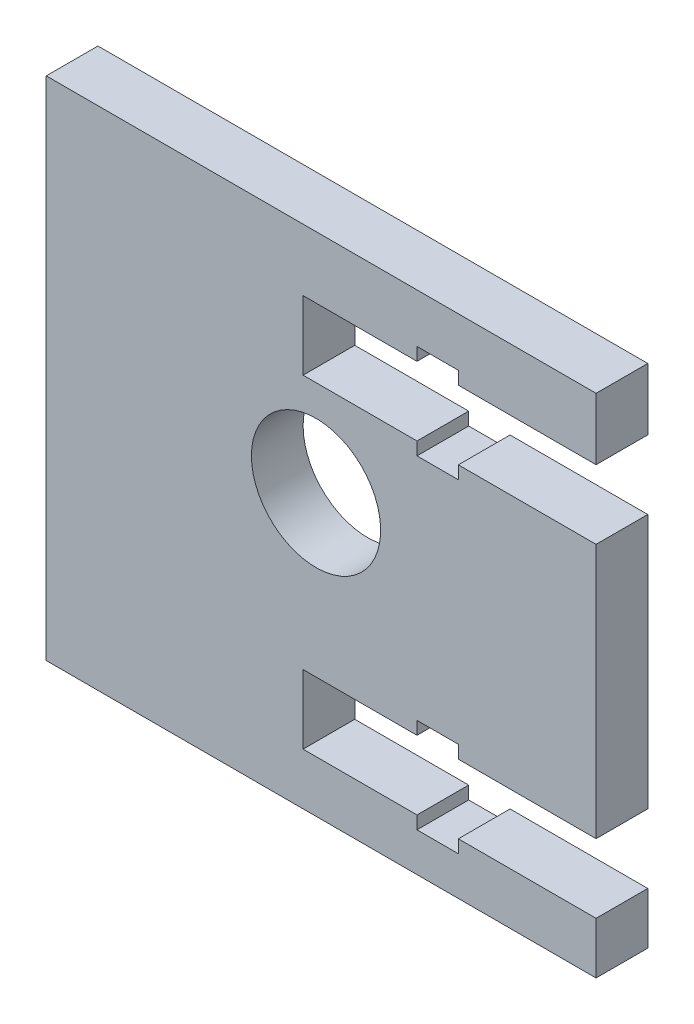
ISO-10303-21;
HEADER;
FILE_DESCRIPTION(('STEP AP214'),'2;1');
FILE_NAME('part.step','',(''),(''),'','','');
FILE_SCHEMA(('AUTOMOTIVE_DESIGN { 1 0 10303 214 1 1 1 1 }'));
ENDSEC;
DATA;
#1=APPLICATION_CONTEXT('core data for automotive mechanical design processes');
#2=APPLICATION_PROTOCOL_DEFINITION('international standard','automotive_design',2000,#1);
#3=PRODUCT_CONTEXT('',#1,'mechanical');
#4=PRODUCT('Part','Part','',(#3));
#5=PRODUCT_RELATED_PRODUCT_CATEGORY('part','',(#4));
#6=PRODUCT_DEFINITION_FORMATION('','',#4);
#7=PRODUCT_DEFINITION_CONTEXT('part definition',#1,'design');
#8=PRODUCT_DEFINITION('design','',#6,#7);
#9=PRODUCT_DEFINITION_SHAPE('','',#8);
#10=(LENGTH_UNIT() NAMED_UNIT(*) SI_UNIT(.MILLI.,.METRE.));
#11=(NAMED_UNIT(*) PLANE_ANGLE_UNIT() SI_UNIT($,.RADIAN.));
#12=(NAMED_UNIT(*) SI_UNIT($,.STERADIAN.) SOLID_ANGLE_UNIT());
#13=UNCERTAINTY_MEASURE_WITH_UNIT(LENGTH_MEASURE(1.E-05),#10,'distance_accuracy_value','');
#14=(GEOMETRIC_REPRESENTATION_CONTEXT(3) GLOBAL_UNCERTAINTY_ASSIGNED_CONTEXT((#13)) GLOBAL_UNIT_ASSIGNED_CONTEXT((#10,
#11,#12)) REPRESENTATION_CONTEXT('',''));
#15=CARTESIAN_POINT('',(0.,0.,0.));
#16=DIRECTION('',(0.,0.,1.));
#17=DIRECTION('',(1.,0.,0.));
#18=AXIS2_PLACEMENT_3D('',#15,#16,#17);
#19=CARTESIAN_POINT('',(29.5456401917048,83.560043446571,3.));
#20=DIRECTION('',(1.,0.,0.));
#21=DIRECTION('',(0.,1.,0.));
#22=AXIS2_PLACEMENT_3D('',#19,#20,#21);
#23=PLANE('',#22);
#24=DIRECTION('',(0.,-1.,0.));
#25=VECTOR('',#24,1.);
#26=CARTESIAN_POINT('',(29.5456401917048,83.560043446571,3.));
#27=LINE('',#26,#25);
#28=CARTESIAN_POINT('',(29.5456401917048,84.150043446571,3.));
#29=VERTEX_POINT('',#28);
#30=CARTESIAN_POINT('',(29.5456401917048,80.560043446571,3.));
#31=VERTEX_POINT('',#30);
#32=EDGE_CURVE('E363',#29,#31,#27,.T.);
#33=ORIENTED_EDGE('',*,*,#32,.T.);
#34=DIRECTION('',(0.,0.,1.));
#35=VECTOR('',#34,1.);
#36=CARTESIAN_POINT('',(29.5456401917048,80.560043446571,-30.));
#37=LINE('',#36,#35);
#38=CARTESIAN_POINT('',(29.5456401917048,80.560043446571,0.));
#39=VERTEX_POINT('',#38);
#40=EDGE_CURVE('E222',#39,#31,#37,.T.);
#41=ORIENTED_EDGE('',*,*,#40,.F.);
#42=DIRECTION('',(0.,-1.,0.));
#43=VECTOR('',#42,1.);
#44=CARTESIAN_POINT('',(29.5456401917048,83.560043446571,0.));
#45=LINE('',#44,#43);
#46=CARTESIAN_POINT('',(29.5456401917048,84.150043446571,0.));
#47=VERTEX_POINT('',#46);
#48=EDGE_CURVE('E217',#47,#39,#45,.T.);
#49=ORIENTED_EDGE('',*,*,#48,.F.);
#50=DIRECTION('',(0.,0.,1.));
#51=VECTOR('',#50,1.);
#52=CARTESIAN_POINT('',(29.5456401917048,84.150043446571,0.));
#53=LINE('',#52,#51);
#54=EDGE_CURVE('E220',#47,#29,#53,.T.);
#55=ORIENTED_EDGE('',*,*,#54,.T.);
#56=EDGE_LOOP('',(#33,#41,#49,#55));
#57=FACE_BOUND('',#56,.T.);
#58=ADVANCED_FACE('F32',(#57),#23,.T.);
#59=CARTESIAN_POINT('',(29.5456401917048,76.560043446571,0.));
#60=VERTEX_POINT('',#59);
#61=CARTESIAN_POINT('',(29.5456401917048,61.7690391399457,0.));
#62=VERTEX_POINT('',#61);
#63=EDGE_CURVE('E226',#60,#62,#45,.T.);
#64=ORIENTED_EDGE('',*,*,#63,.F.);
#65=DIRECTION('',(0.,0.,1.));
#66=VECTOR('',#65,1.);
#67=CARTESIAN_POINT('',(29.5456401917048,76.560043446571,-30.));
#68=LINE('',#67,#66);
#69=CARTESIAN_POINT('',(29.5456401917048,76.560043446571,3.));
#70=VERTEX_POINT('',#69);
#71=EDGE_CURVE('E300',#60,#70,#68,.T.);
#72=ORIENTED_EDGE('',*,*,#71,.T.);
#73=CARTESIAN_POINT('',(29.5456401917048,61.7690391399457,3.));
#74=VERTEX_POINT('',#73);
#75=EDGE_CURVE('E366',#70,#74,#27,.T.);
#76=ORIENTED_EDGE('',*,*,#75,.T.);
#77=DIRECTION('',(0.,0.,1.));
#78=VECTOR('',#77,1.);
#79=CARTESIAN_POINT('',(29.5456401917048,61.7690391399457,-30.));
#80=LINE('',#79,#78);
#81=EDGE_CURVE('E309',#62,#74,#80,.T.);
#82=ORIENTED_EDGE('',*,*,#81,.F.);
#83=EDGE_LOOP('',(#64,#72,#76,#82));
#84=FACE_BOUND('',#83,.T.);
#85=ADVANCED_FACE('F439',(#84),#23,.T.);
#86=DIRECTION('',(0.,0.,1.));
#87=VECTOR('',#86,1.);
#88=CARTESIAN_POINT('',(29.5456401917048,57.7690391399457,-30.));
#89=LINE('',#88,#87);
#90=CARTESIAN_POINT('',(29.5456401917048,57.7690391399457,0.));
#91=VERTEX_POINT('',#90);
#92=CARTESIAN_POINT('',(29.5456401917048,57.7690391399457,3.));
#93=VERTEX_POINT('',#92);
#94=EDGE_CURVE('E305',#91,#93,#89,.T.);
#95=ORIENTED_EDGE('',*,*,#94,.T.);
#96=CARTESIAN_POINT('',(29.5456401917048,54.7690391399457,3.));
#97=VERTEX_POINT('',#96);
#98=EDGE_CURVE('E367',#93,#97,#27,.T.);
#99=ORIENTED_EDGE('',*,*,#98,.T.);
#100=DIRECTION('',(0.,0.,-1.));
#101=VECTOR('',#100,1.);
#102=CARTESIAN_POINT('',(29.5456401917048,54.7690391399457,3.));
#103=LINE('',#102,#101);
#104=CARTESIAN_POINT('',(29.5456401917048,54.7690391399457,0.));
#105=VERTEX_POINT('',#104);
#106=EDGE_CURVE('E371',#97,#105,#103,.T.);
#107=ORIENTED_EDGE('',*,*,#106,.T.);
#108=EDGE_CURVE('E228',#91,#105,#45,.T.);
#109=ORIENTED_EDGE('',*,*,#108,.F.);
#110=EDGE_LOOP('',(#95,#99,#107,#109));
#111=FACE_BOUND('',#110,.T.);
#112=ADVANCED_FACE('F447',(#111),#23,.T.);
#113=CARTESIAN_POINT('',(0.,0.,3.));
#114=DIRECTION('',(0.,0.,-1.));
#115=DIRECTION('',(-1.,0.,0.));
#116=AXIS2_PLACEMENT_3D('',#113,#114,#115);
#117=PLANE('',#116);
#118=CARTESIAN_POINT('',(13.2979166249883,71.0167627066596,3.));
#119=DIRECTION('',(0.,0.,-1.));
#120=DIRECTION('',(-1.,0.,0.));
#121=AXIS2_PLACEMENT_3D('',#118,#119,#120);
#122=CIRCLE('',#121,3.75000000000002);
#123=CARTESIAN_POINT('',(9.54791662498832,71.0167627066596,3.));
#124=VERTEX_POINT('',#123);
#125=EDGE_CURVE('E360',#124,#124,#122,.T.);
#126=ORIENTED_EDGE('',*,*,#125,.T.);
#127=EDGE_LOOP('',(#126));
#128=FACE_BOUND('',#127,.T.);
#129=DIRECTION('',(1.,0.,0.));
#130=VECTOR('',#129,1.);
#131=CARTESIAN_POINT('',(21.5557408577982,80.560043446571,3.));
#132=LINE('',#131,#130);
#133=CARTESIAN_POINT('',(21.5557408577982,80.560043446571,3.));
#134=VERTEX_POINT('',#133);
#135=EDGE_CURVE('E247',#134,#31,#132,.T.);
#136=ORIENTED_EDGE('',*,*,#135,.T.);
#137=ORIENTED_EDGE('',*,*,#32,.F.);
#138=DIRECTION('',(-1.,0.,0.));
#139=VECTOR('',#138,1.);
#140=CARTESIAN_POINT('',(29.5456401917048,84.150043446571,3.));
#141=LINE('',#140,#139);
#142=CARTESIAN_POINT('',(-2.35612776278136,84.150043446571,3.));
#143=VERTEX_POINT('',#142);
#144=EDGE_CURVE('E235',#29,#143,#141,.T.);
#145=ORIENTED_EDGE('',*,*,#144,.T.);
#146=DIRECTION('',(0.,-1.,0.));
#147=VECTOR('',#146,1.);
#148=CARTESIAN_POINT('',(-2.35612776278136,83.560043446571,3.));
#149=LINE('',#148,#147);
#150=CARTESIAN_POINT('',(-2.35612776278136,54.7690391399457,3.));
#151=VERTEX_POINT('',#150);
#152=EDGE_CURVE('E370',#143,#151,#149,.T.);
#153=ORIENTED_EDGE('',*,*,#152,.T.);
#154=DIRECTION('',(1.,0.,0.));
#155=VECTOR('',#154,1.);
#156=CARTESIAN_POINT('',(-2.35612776278136,54.7690391399457,3.));
#157=LINE('',#156,#155);
#158=EDGE_CURVE('E365',#151,#97,#157,.T.);
#159=ORIENTED_EDGE('',*,*,#158,.T.);
#160=ORIENTED_EDGE('',*,*,#98,.F.);
#161=DIRECTION('',(1.,0.,0.));
#162=VECTOR('',#161,1.);
#163=CARTESIAN_POINT('',(21.5557408577982,57.7690391399457,3.));
#164=LINE('',#163,#162);
#165=CARTESIAN_POINT('',(21.5557408577982,57.7690391399457,3.));
#166=VERTEX_POINT('',#165);
#167=EDGE_CURVE('E251',#166,#93,#164,.T.);
#168=ORIENTED_EDGE('',*,*,#167,.F.);
#169=DIRECTION('',(0.,1.,0.));
#170=VECTOR('',#169,1.);
#171=CARTESIAN_POINT('',(21.5557408577982,57.0190391399457,3.));
#172=LINE('',#171,#170);
#173=CARTESIAN_POINT('',(21.5557408577982,57.0190391399457,3.));
#174=VERTEX_POINT('',#173);
#175=EDGE_CURVE('E308',#174,#166,#172,.T.);
#176=ORIENTED_EDGE('',*,*,#175,.F.);
#177=DIRECTION('',(1.,0.,0.));
#178=VECTOR('',#177,1.);
#179=CARTESIAN_POINT('',(19.1557408577982,57.0190391399457,3.));
#180=LINE('',#179,#178);
#181=CARTESIAN_POINT('',(19.1557408577982,57.0190391399457,3.));
#182=VERTEX_POINT('',#181);
#183=EDGE_CURVE('E331',#182,#174,#180,.T.);
#184=ORIENTED_EDGE('',*,*,#183,.F.);
#185=DIRECTION('',(0.,-1.,0.));
#186=VECTOR('',#185,1.);
#187=CARTESIAN_POINT('',(19.1557408577982,57.7690391399457,3.));
#188=LINE('',#187,#186);
#189=CARTESIAN_POINT('',(19.1557408577982,57.7690391399457,3.));
#190=VERTEX_POINT('',#189);
#191=EDGE_CURVE('E334',#190,#182,#188,.T.);
#192=ORIENTED_EDGE('',*,*,#191,.F.);
#193=DIRECTION('',(1.,0.,0.));
#194=VECTOR('',#193,1.);
#195=CARTESIAN_POINT('',(12.5456401917048,57.7690391399457,3.));
#196=LINE('',#195,#194);
#197=CARTESIAN_POINT('',(12.5456401917048,57.7690391399457,3.));
#198=VERTEX_POINT('',#197);
#199=EDGE_CURVE('E337',#198,#190,#196,.T.);
#200=ORIENTED_EDGE('',*,*,#199,.F.);
#201=DIRECTION('',(0.,-1.,0.));
#202=VECTOR('',#201,1.);
#203=CARTESIAN_POINT('',(12.5456401917048,61.7690391399457,3.));
#204=LINE('',#203,#202);
#205=CARTESIAN_POINT('',(12.5456401917048,61.7690391399457,3.));
#206=VERTEX_POINT('',#205);
#207=EDGE_CURVE('E340',#206,#198,#204,.T.);
#208=ORIENTED_EDGE('',*,*,#207,.F.);
#209=DIRECTION('',(-1.,0.,0.));
#210=VECTOR('',#209,1.);
#211=CARTESIAN_POINT('',(19.1557408577982,61.7690391399457,3.));
#212=LINE('',#211,#210);
#213=CARTESIAN_POINT('',(19.1557408577982,61.7690391399457,3.));
#214=VERTEX_POINT('',#213);
#215=EDGE_CURVE('E343',#214,#206,#212,.T.);
#216=ORIENTED_EDGE('',*,*,#215,.F.);
#217=DIRECTION('',(0.,1.,0.));
#218=VECTOR('',#217,1.);
#219=CARTESIAN_POINT('',(19.1557408577982,61.7690391399457,3.));
#220=LINE('',#219,#218);
#221=CARTESIAN_POINT('',(19.1557408577982,62.5190391399457,3.));
#222=VERTEX_POINT('',#221);
#223=EDGE_CURVE('E346',#214,#222,#220,.T.);
#224=ORIENTED_EDGE('',*,*,#223,.T.);
#225=DIRECTION('',(1.,0.,0.));
#226=VECTOR('',#225,1.);
#227=CARTESIAN_POINT('',(19.1557408577982,62.5190391399457,3.));
#228=LINE('',#227,#226);
#229=CARTESIAN_POINT('',(21.5557408577982,62.5190391399457,3.));
#230=VERTEX_POINT('',#229);
#231=EDGE_CURVE('E349',#222,#230,#228,.T.);
#232=ORIENTED_EDGE('',*,*,#231,.T.);
#233=DIRECTION('',(0.,-1.,0.));
#234=VECTOR('',#233,1.);
#235=CARTESIAN_POINT('',(21.5557408577982,62.5190391399457,3.));
#236=LINE('',#235,#234);
#237=CARTESIAN_POINT('',(21.5557408577982,61.7690391399457,3.));
#238=VERTEX_POINT('',#237);
#239=EDGE_CURVE('E352',#230,#238,#236,.T.);
#240=ORIENTED_EDGE('',*,*,#239,.T.);
#241=DIRECTION('',(-1.,0.,0.));
#242=VECTOR('',#241,1.);
#243=CARTESIAN_POINT('',(29.5456401917048,61.7690391399457,3.));
#244=LINE('',#243,#242);
#245=EDGE_CURVE('E355',#74,#238,#244,.T.);
#246=ORIENTED_EDGE('',*,*,#245,.F.);
#247=ORIENTED_EDGE('',*,*,#75,.F.);
#248=DIRECTION('',(-1.,0.,0.));
#249=VECTOR('',#248,1.);
#250=CARTESIAN_POINT('',(29.5456401917048,76.560043446571,3.));
#251=LINE('',#250,#249);
#252=CARTESIAN_POINT('',(21.5557408577982,76.560043446571,3.));
#253=VERTEX_POINT('',#252);
#254=EDGE_CURVE('E250',#70,#253,#251,.T.);
#255=ORIENTED_EDGE('',*,*,#254,.T.);
#256=DIRECTION('',(0.,1.,0.));
#257=VECTOR('',#256,1.);
#258=CARTESIAN_POINT('',(21.5557408577982,75.810043446571,3.));
#259=LINE('',#258,#257);
#260=CARTESIAN_POINT('',(21.5557408577982,75.810043446571,3.));
#261=VERTEX_POINT('',#260);
#262=EDGE_CURVE('E254',#261,#253,#259,.T.);
#263=ORIENTED_EDGE('',*,*,#262,.F.);
#264=DIRECTION('',(1.,0.,0.));
#265=VECTOR('',#264,1.);
#266=CARTESIAN_POINT('',(19.1557408577982,75.810043446571,3.));
#267=LINE('',#266,#265);
#268=CARTESIAN_POINT('',(19.1557408577982,75.810043446571,3.));
#269=VERTEX_POINT('',#268);
#270=EDGE_CURVE('E257',#269,#261,#267,.T.);
#271=ORIENTED_EDGE('',*,*,#270,.F.);
#272=DIRECTION('',(0.,-1.,0.));
#273=VECTOR('',#272,1.);
#274=CARTESIAN_POINT('',(19.1557408577982,76.560043446571,3.));
#275=LINE('',#274,#273);
#276=CARTESIAN_POINT('',(19.1557408577982,76.560043446571,3.));
#277=VERTEX_POINT('',#276);
#278=EDGE_CURVE('E260',#277,#269,#275,.T.);
#279=ORIENTED_EDGE('',*,*,#278,.F.);
#280=DIRECTION('',(-1.,0.,0.));
#281=VECTOR('',#280,1.);
#282=CARTESIAN_POINT('',(19.1557408577982,76.560043446571,3.));
#283=LINE('',#282,#281);
#284=CARTESIAN_POINT('',(12.5456401917048,76.560043446571,3.));
#285=VERTEX_POINT('',#284);
#286=EDGE_CURVE('E263',#277,#285,#283,.T.);
#287=ORIENTED_EDGE('',*,*,#286,.T.);
#288=DIRECTION('',(0.,1.,0.));
#289=VECTOR('',#288,1.);
#290=CARTESIAN_POINT('',(12.5456401917048,76.560043446571,3.));
#291=LINE('',#290,#289);
#292=CARTESIAN_POINT('',(12.5456401917048,80.560043446571,3.));
#293=VERTEX_POINT('',#292);
#294=EDGE_CURVE('E266',#285,#293,#291,.T.);
#295=ORIENTED_EDGE('',*,*,#294,.T.);
#296=DIRECTION('',(1.,0.,0.));
#297=VECTOR('',#296,1.);
#298=CARTESIAN_POINT('',(12.5456401917048,80.560043446571,3.));
#299=LINE('',#298,#297);
#300=CARTESIAN_POINT('',(19.1557408577982,80.560043446571,3.));
#301=VERTEX_POINT('',#300);
#302=EDGE_CURVE('E269',#293,#301,#299,.T.);
#303=ORIENTED_EDGE('',*,*,#302,.T.);
#304=DIRECTION('',(0.,1.,0.));
#305=VECTOR('',#304,1.);
#306=CARTESIAN_POINT('',(19.1557408577982,80.560043446571,3.));
#307=LINE('',#306,#305);
#308=CARTESIAN_POINT('',(19.1557408577982,81.310043446571,3.));
#309=VERTEX_POINT('',#308);
#310=EDGE_CURVE('E272',#301,#309,#307,.T.);
#311=ORIENTED_EDGE('',*,*,#310,.T.);
#312=DIRECTION('',(1.,0.,0.));
#313=VECTOR('',#312,1.);
#314=CARTESIAN_POINT('',(19.1557408577982,81.310043446571,3.));
#315=LINE('',#314,#313);
#316=CARTESIAN_POINT('',(21.5557408577982,81.310043446571,3.));
#317=VERTEX_POINT('',#316);
#318=EDGE_CURVE('E275',#309,#317,#315,.T.);
#319=ORIENTED_EDGE('',*,*,#318,.T.);
#320=DIRECTION('',(0.,-1.,0.));
#321=VECTOR('',#320,1.);
#322=CARTESIAN_POINT('',(21.5557408577982,81.310043446571,3.));
#323=LINE('',#322,#321);
#324=EDGE_CURVE('E278',#317,#134,#323,.T.);
#325=ORIENTED_EDGE('',*,*,#324,.T.);
#326=EDGE_LOOP('',(#136,#137,#145,#153,#159,#160,#168,#176,#184,#192,#200,#208,#216,#224,#232,
#240,#246,#247,#255,#263,#271,#279,#287,#295,#303,#311,#319,#325));
#327=FACE_BOUND('',#326,.T.);
#328=ADVANCED_FACE('F456',(#128,#327),#117,.F.);
#329=CARTESIAN_POINT('',(0.,0.,0.));
#330=DIRECTION('',(0.,0.,-1.));
#331=DIRECTION('',(-1.,0.,0.));
#332=AXIS2_PLACEMENT_3D('',#329,#330,#331);
#333=PLANE('',#332);
#334=CARTESIAN_POINT('',(13.2979166249883,71.0167627066596,0.));
#335=DIRECTION('',(0.,0.,-1.));
#336=DIRECTION('',(-1.,0.,0.));
#337=AXIS2_PLACEMENT_3D('',#334,#335,#336);
#338=CIRCLE('',#337,3.75000000000002);
#339=CARTESIAN_POINT('',(9.54791662498832,71.0167627066596,0.));
#340=VERTEX_POINT('',#339);
#341=EDGE_CURVE('E304',#340,#340,#338,.T.);
#342=ORIENTED_EDGE('',*,*,#341,.F.);
#343=EDGE_LOOP('',(#342));
#344=FACE_BOUND('',#343,.T.);
#345=ORIENTED_EDGE('',*,*,#48,.T.);
#346=DIRECTION('',(-1.,0.,0.));
#347=VECTOR('',#346,1.);
#348=CARTESIAN_POINT('',(0.,80.560043446571,0.));
#349=LINE('',#348,#347);
#350=CARTESIAN_POINT('',(21.5557408577982,80.560043446571,0.));
#351=VERTEX_POINT('',#350);
#352=EDGE_CURVE('E11',#39,#351,#349,.T.);
#353=ORIENTED_EDGE('',*,*,#352,.T.);
#354=DIRECTION('',(0.,1.,0.));
#355=VECTOR('',#354,1.);
#356=CARTESIAN_POINT('',(21.5557408577982,0.,0.));
#357=LINE('',#356,#355);
#358=CARTESIAN_POINT('',(21.5557408577982,81.310043446571,0.));
#359=VERTEX_POINT('',#358);
#360=EDGE_CURVE('E406',#351,#359,#357,.T.);
#361=ORIENTED_EDGE('',*,*,#360,.T.);
#362=DIRECTION('',(-1.,0.,0.));
#363=VECTOR('',#362,1.);
#364=CARTESIAN_POINT('',(4.70168137331537E-13,81.3100434465711,0.));
#365=LINE('',#364,#363);
#366=CARTESIAN_POINT('',(19.1557408577982,81.310043446571,0.));
#367=VERTEX_POINT('',#366);
#368=EDGE_CURVE('E409',#359,#367,#365,.T.);
#369=ORIENTED_EDGE('',*,*,#368,.T.);
#370=DIRECTION('',(0.,-1.,0.));
#371=VECTOR('',#370,1.);
#372=CARTESIAN_POINT('',(19.1557408577982,0.,0.));
#373=LINE('',#372,#371);
#374=CARTESIAN_POINT('',(19.1557408577982,80.560043446571,0.));
#375=VERTEX_POINT('',#374);
#376=EDGE_CURVE('E412',#367,#375,#373,.T.);
#377=ORIENTED_EDGE('',*,*,#376,.T.);
#378=DIRECTION('',(-1.,0.,0.));
#379=VECTOR('',#378,1.);
#380=CARTESIAN_POINT('',(0.,80.560043446571,0.));
#381=LINE('',#380,#379);
#382=CARTESIAN_POINT('',(12.5456401917048,80.560043446571,0.));
#383=VERTEX_POINT('',#382);
#384=EDGE_CURVE('E415',#375,#383,#381,.T.);
#385=ORIENTED_EDGE('',*,*,#384,.T.);
#386=DIRECTION('',(0.,-1.,0.));
#387=VECTOR('',#386,1.);
#388=CARTESIAN_POINT('',(12.5456401917048,0.,0.));
#389=LINE('',#388,#387);
#390=CARTESIAN_POINT('',(12.5456401917048,76.560043446571,0.));
#391=VERTEX_POINT('',#390);
#392=EDGE_CURVE('E418',#383,#391,#389,.T.);
#393=ORIENTED_EDGE('',*,*,#392,.T.);
#394=DIRECTION('',(1.,0.,0.));
#395=VECTOR('',#394,1.);
#396=CARTESIAN_POINT('',(0.,76.560043446571,0.));
#397=LINE('',#396,#395);
#398=CARTESIAN_POINT('',(19.1557408577982,76.560043446571,0.));
#399=VERTEX_POINT('',#398);
#400=EDGE_CURVE('E421',#391,#399,#397,.T.);
#401=ORIENTED_EDGE('',*,*,#400,.T.);
#402=DIRECTION('',(0.,1.,0.));
#403=VECTOR('',#402,1.);
#404=CARTESIAN_POINT('',(19.1557408577982,0.,0.));
#405=LINE('',#404,#403);
#406=CARTESIAN_POINT('',(19.1557408577982,75.810043446571,0.));
#407=VERTEX_POINT('',#406);
#408=EDGE_CURVE('E424',#407,#399,#405,.T.);
#409=ORIENTED_EDGE('',*,*,#408,.F.);
#410=DIRECTION('',(-1.,0.,0.));
#411=VECTOR('',#410,1.);
#412=CARTESIAN_POINT('',(0.,75.810043446571,0.));
#413=LINE('',#412,#411);
#414=CARTESIAN_POINT('',(21.5557408577982,75.810043446571,0.));
#415=VERTEX_POINT('',#414);
#416=EDGE_CURVE('E426',#415,#407,#413,.T.);
#417=ORIENTED_EDGE('',*,*,#416,.F.);
#418=DIRECTION('',(0.,-1.,0.));
#419=VECTOR('',#418,1.);
#420=CARTESIAN_POINT('',(21.5557408577982,0.,0.));
#421=LINE('',#420,#419);
#422=CARTESIAN_POINT('',(21.5557408577982,76.560043446571,0.));
#423=VERTEX_POINT('',#422);
#424=EDGE_CURVE('E428',#423,#415,#421,.T.);
#425=ORIENTED_EDGE('',*,*,#424,.F.);
#426=DIRECTION('',(1.,0.,0.));
#427=VECTOR('',#426,1.);
#428=CARTESIAN_POINT('',(0.,76.560043446571,0.));
#429=LINE('',#428,#427);
#430=EDGE_CURVE('E39',#423,#60,#429,.T.);
#431=ORIENTED_EDGE('',*,*,#430,.T.);
#432=ORIENTED_EDGE('',*,*,#63,.T.);
#433=DIRECTION('',(1.,0.,0.));
#434=VECTOR('',#433,1.);
#435=CARTESIAN_POINT('',(0.,61.7690391399457,0.));
#436=LINE('',#435,#434);
#437=CARTESIAN_POINT('',(21.5557408577982,61.7690391399457,0.));
#438=VERTEX_POINT('',#437);
#439=EDGE_CURVE('E379',#438,#62,#436,.T.);
#440=ORIENTED_EDGE('',*,*,#439,.F.);
#441=DIRECTION('',(0.,1.,0.));
#442=VECTOR('',#441,1.);
#443=CARTESIAN_POINT('',(21.5557408577985,0.,0.));
#444=LINE('',#443,#442);
#445=CARTESIAN_POINT('',(21.5557408577982,62.5190391399457,0.));
#446=VERTEX_POINT('',#445);
#447=EDGE_CURVE('E383',#438,#446,#444,.T.);
#448=ORIENTED_EDGE('',*,*,#447,.T.);
#449=DIRECTION('',(-1.,0.,0.));
#450=VECTOR('',#449,1.);
#451=CARTESIAN_POINT('',(0.,62.5190391399457,0.));
#452=LINE('',#451,#450);
#453=CARTESIAN_POINT('',(19.1557408577982,62.5190391399457,0.));
#454=VERTEX_POINT('',#453);
#455=EDGE_CURVE('E386',#446,#454,#452,.T.);
#456=ORIENTED_EDGE('',*,*,#455,.T.);
#457=DIRECTION('',(0.,-1.,0.));
#458=VECTOR('',#457,1.);
#459=CARTESIAN_POINT('',(19.1557408577985,0.,0.));
#460=LINE('',#459,#458);
#461=CARTESIAN_POINT('',(19.1557408577982,61.7690391399457,0.));
#462=VERTEX_POINT('',#461);
#463=EDGE_CURVE('E389',#454,#462,#460,.T.);
#464=ORIENTED_EDGE('',*,*,#463,.T.);
#465=DIRECTION('',(1.,0.,0.));
#466=VECTOR('',#465,1.);
#467=CARTESIAN_POINT('',(0.,61.7690391399457,0.));
#468=LINE('',#467,#466);
#469=CARTESIAN_POINT('',(12.5456401917048,61.7690391399457,0.));
#470=VERTEX_POINT('',#469);
#471=EDGE_CURVE('E392',#470,#462,#468,.T.);
#472=ORIENTED_EDGE('',*,*,#471,.F.);
#473=DIRECTION('',(0.,1.,0.));
#474=VECTOR('',#473,1.);
#475=CARTESIAN_POINT('',(12.5456401917048,0.,0.));
#476=LINE('',#475,#474);
#477=CARTESIAN_POINT('',(12.5456401917048,57.7690391399457,0.));
#478=VERTEX_POINT('',#477);
#479=EDGE_CURVE('E394',#478,#470,#476,.T.);
#480=ORIENTED_EDGE('',*,*,#479,.F.);
#481=DIRECTION('',(-1.,0.,0.));
#482=VECTOR('',#481,1.);
#483=CARTESIAN_POINT('',(0.,57.7690391399457,0.));
#484=LINE('',#483,#482);
#485=CARTESIAN_POINT('',(19.1557408577982,57.7690391399457,0.));
#486=VERTEX_POINT('',#485);
#487=EDGE_CURVE('E396',#486,#478,#484,.T.);
#488=ORIENTED_EDGE('',*,*,#487,.F.);
#489=DIRECTION('',(0.,1.,0.));
#490=VECTOR('',#489,1.);
#491=CARTESIAN_POINT('',(19.1557408577982,0.,0.));
#492=LINE('',#491,#490);
#493=CARTESIAN_POINT('',(19.1557408577982,57.0190391399457,0.));
#494=VERTEX_POINT('',#493);
#495=EDGE_CURVE('E398',#494,#486,#492,.T.);
#496=ORIENTED_EDGE('',*,*,#495,.F.);
#497=DIRECTION('',(-1.,0.,0.));
#498=VECTOR('',#497,1.);
#499=CARTESIAN_POINT('',(-3.29707552579013E-13,57.0190391399456,0.));
#500=LINE('',#499,#498);
#501=CARTESIAN_POINT('',(21.5557408577982,57.0190391399457,0.));
#502=VERTEX_POINT('',#501);
#503=EDGE_CURVE('E400',#502,#494,#500,.T.);
#504=ORIENTED_EDGE('',*,*,#503,.F.);
#505=DIRECTION('',(0.,-1.,0.));
#506=VECTOR('',#505,1.);
#507=CARTESIAN_POINT('',(21.5557408577982,0.,0.));
#508=LINE('',#507,#506);
#509=CARTESIAN_POINT('',(21.5557408577982,57.7690391399457,0.));
#510=VERTEX_POINT('',#509);
#511=EDGE_CURVE('E402',#510,#502,#508,.T.);
#512=ORIENTED_EDGE('',*,*,#511,.F.);
#513=DIRECTION('',(-1.,0.,0.));
#514=VECTOR('',#513,1.);
#515=CARTESIAN_POINT('',(0.,57.7690391399457,0.));
#516=LINE('',#515,#514);
#517=EDGE_CURVE('E404',#91,#510,#516,.T.);
#518=ORIENTED_EDGE('',*,*,#517,.F.);
#519=ORIENTED_EDGE('',*,*,#108,.T.);
#520=DIRECTION('',(1.,0.,0.));
#521=VECTOR('',#520,1.);
#522=CARTESIAN_POINT('',(-2.35612776278136,54.7690391399457,0.));
#523=LINE('',#522,#521);
#524=CARTESIAN_POINT('',(-2.35612776278136,54.7690391399457,0.));
#525=VERTEX_POINT('',#524);
#526=EDGE_CURVE('E225',#525,#105,#523,.T.);
#527=ORIENTED_EDGE('',*,*,#526,.F.);
#528=DIRECTION('',(0.,-1.,0.));
#529=VECTOR('',#528,1.);
#530=CARTESIAN_POINT('',(-2.35612776278136,83.560043446571,0.));
#531=LINE('',#530,#529);
#532=CARTESIAN_POINT('',(-2.35612776278136,84.150043446571,0.));
#533=VERTEX_POINT('',#532);
#534=EDGE_CURVE('E240',#533,#525,#531,.T.);
#535=ORIENTED_EDGE('',*,*,#534,.F.);
#536=DIRECTION('',(-1.,0.,0.));
#537=VECTOR('',#536,1.);
#538=CARTESIAN_POINT('',(29.5456401917048,84.150043446571,0.));
#539=LINE('',#538,#537);
#540=EDGE_CURVE('E233',#47,#533,#539,.T.);
#541=ORIENTED_EDGE('',*,*,#540,.F.);
#542=EDGE_LOOP('',(#345,#353,#361,#369,#377,#385,#393,#401,#409,#417,#425,#431,#432,#440,#448,
#456,#464,#472,#480,#488,#496,#504,#512,#518,#519,#527,#535,#541));
#543=FACE_BOUND('',#542,.T.);
#544=ADVANCED_FACE('F238',(#344,#543),#333,.T.);
#545=CARTESIAN_POINT('',(-2.35612776278136,83.560043446571,3.));
#546=DIRECTION('',(1.,0.,0.));
#547=DIRECTION('',(0.,1.,0.));
#548=AXIS2_PLACEMENT_3D('',#545,#546,#547);
#549=PLANE('',#548);
#550=ORIENTED_EDGE('',*,*,#534,.T.);
#551=DIRECTION('',(0.,0.,-1.));
#552=VECTOR('',#551,1.);
#553=CARTESIAN_POINT('',(-2.35612776278136,54.7690391399457,3.));
#554=LINE('',#553,#552);
#555=EDGE_CURVE('E376',#151,#525,#554,.T.);
#556=ORIENTED_EDGE('',*,*,#555,.F.);
#557=ORIENTED_EDGE('',*,*,#152,.F.);
#558=DIRECTION('',(0.,0.,1.));
#559=VECTOR('',#558,1.);
#560=CARTESIAN_POINT('',(-2.35612776278136,84.150043446571,0.));
#561=LINE('',#560,#559);
#562=EDGE_CURVE('E236',#533,#143,#561,.T.);
#563=ORIENTED_EDGE('',*,*,#562,.F.);
#564=EDGE_LOOP('',(#550,#556,#557,#563));
#565=FACE_BOUND('',#564,.T.);
#566=ADVANCED_FACE('F454',(#565),#549,.F.);
#567=CARTESIAN_POINT('',(-2.35612776278136,54.7690391399457,3.));
#568=DIRECTION('',(0.,1.,0.));
#569=DIRECTION('',(0.,0.,1.));
#570=AXIS2_PLACEMENT_3D('',#567,#568,#569);
#571=PLANE('',#570);
#572=ORIENTED_EDGE('',*,*,#526,.T.);
#573=ORIENTED_EDGE('',*,*,#106,.F.);
#574=ORIENTED_EDGE('',*,*,#158,.F.);
#575=ORIENTED_EDGE('',*,*,#555,.T.);
#576=EDGE_LOOP('',(#572,#573,#574,#575));
#577=FACE_BOUND('',#576,.T.);
#578=ADVANCED_FACE('F451',(#577),#571,.F.);
#579=CARTESIAN_POINT('',(13.2979166249883,71.0167627066596,33.));
#580=DIRECTION('',(0.,0.,-1.));
#581=DIRECTION('',(-1.,0.,0.));
#582=AXIS2_PLACEMENT_3D('',#579,#580,#581);
#583=CYLINDRICAL_SURFACE('',#582,3.75000000000002);
#584=ORIENTED_EDGE('',*,*,#341,.T.);
#585=EDGE_LOOP('',(#584));
#586=FACE_BOUND('',#585,.T.);
#587=ORIENTED_EDGE('',*,*,#125,.F.);
#588=EDGE_LOOP('',(#587));
#589=FACE_BOUND('',#588,.T.);
#590=ADVANCED_FACE('F542',(#586,#589),#583,.F.);
#591=CARTESIAN_POINT('',(21.5557408577982,57.7690391399457,-30.));
#592=DIRECTION('',(0.,-1.,0.));
#593=DIRECTION('',(0.,0.,-1.));
#594=AXIS2_PLACEMENT_3D('',#591,#592,#593);
#595=PLANE('',#594);
#596=ORIENTED_EDGE('',*,*,#517,.T.);
#597=DIRECTION('',(0.,0.,1.));
#598=VECTOR('',#597,1.);
#599=CARTESIAN_POINT('',(21.5557408577982,57.7690391399457,-30.));
#600=LINE('',#599,#598);
#601=EDGE_CURVE('E245',#510,#166,#600,.T.);
#602=ORIENTED_EDGE('',*,*,#601,.T.);
#603=ORIENTED_EDGE('',*,*,#167,.T.);
#604=ORIENTED_EDGE('',*,*,#94,.F.);
#605=EDGE_LOOP('',(#596,#602,#603,#604));
#606=FACE_BOUND('',#605,.T.);
#607=ADVANCED_FACE('F540',(#606),#595,.F.);
#608=CARTESIAN_POINT('',(21.5557408577982,57.0190391399457,-30.));
#609=DIRECTION('',(1.,0.,0.));
#610=DIRECTION('',(0.,0.,-1.));
#611=AXIS2_PLACEMENT_3D('',#608,#609,#610);
#612=PLANE('',#611);
#613=ORIENTED_EDGE('',*,*,#511,.T.);
#614=DIRECTION('',(0.,0.,1.));
#615=VECTOR('',#614,1.);
#616=CARTESIAN_POINT('',(21.5557408577982,57.0190391399457,-30.));
#617=LINE('',#616,#615);
#618=EDGE_CURVE('E326',#502,#174,#617,.T.);
#619=ORIENTED_EDGE('',*,*,#618,.T.);
#620=ORIENTED_EDGE('',*,*,#175,.T.);
#621=ORIENTED_EDGE('',*,*,#601,.F.);
#622=EDGE_LOOP('',(#613,#619,#620,#621));
#623=FACE_BOUND('',#622,.T.);
#624=ADVANCED_FACE('F536',(#623),#612,.F.);
#625=CARTESIAN_POINT('',(19.1557408577982,57.0190391399457,-30.));
#626=DIRECTION('',(0.,-1.,0.));
#627=DIRECTION('',(1.,0.,0.));
#628=AXIS2_PLACEMENT_3D('',#625,#626,#627);
#629=PLANE('',#628);
#630=ORIENTED_EDGE('',*,*,#503,.T.);
#631=DIRECTION('',(0.,0.,1.));
#632=VECTOR('',#631,1.);
#633=CARTESIAN_POINT('',(19.1557408577982,57.0190391399457,-30.));
#634=LINE('',#633,#632);
#635=EDGE_CURVE('E324',#494,#182,#634,.T.);
#636=ORIENTED_EDGE('',*,*,#635,.T.);
#637=ORIENTED_EDGE('',*,*,#183,.T.);
#638=ORIENTED_EDGE('',*,*,#618,.F.);
#639=EDGE_LOOP('',(#630,#636,#637,#638));
#640=FACE_BOUND('',#639,.T.);
#641=ADVANCED_FACE('F532',(#640),#629,.F.);
#642=CARTESIAN_POINT('',(19.1557408577982,57.7690391399457,-30.));
#643=DIRECTION('',(-1.,0.,0.));
#644=DIRECTION('',(0.,0.,1.));
#645=AXIS2_PLACEMENT_3D('',#642,#643,#644);
#646=PLANE('',#645);
#647=ORIENTED_EDGE('',*,*,#495,.T.);
#648=DIRECTION('',(0.,0.,1.));
#649=VECTOR('',#648,1.);
#650=CARTESIAN_POINT('',(19.1557408577982,57.7690391399457,-30.));
#651=LINE('',#650,#649);
#652=EDGE_CURVE('E322',#486,#190,#651,.T.);
#653=ORIENTED_EDGE('',*,*,#652,.T.);
#654=ORIENTED_EDGE('',*,*,#191,.T.);
#655=ORIENTED_EDGE('',*,*,#635,.F.);
#656=EDGE_LOOP('',(#647,#653,#654,#655));
#657=FACE_BOUND('',#656,.T.);
#658=ADVANCED_FACE('F529',(#657),#646,.F.);
#659=CARTESIAN_POINT('',(12.5456401917048,57.7690391399457,-30.));
#660=DIRECTION('',(0.,-1.,0.));
#661=DIRECTION('',(0.,0.,-1.));
#662=AXIS2_PLACEMENT_3D('',#659,#660,#661);
#663=PLANE('',#662);
#664=ORIENTED_EDGE('',*,*,#487,.T.);
#665=DIRECTION('',(0.,0.,1.));
#666=VECTOR('',#665,1.);
#667=CARTESIAN_POINT('',(12.5456401917048,57.7690391399457,-30.));
#668=LINE('',#667,#666);
#669=EDGE_CURVE('E320',#478,#198,#668,.T.);
#670=ORIENTED_EDGE('',*,*,#669,.T.);
#671=ORIENTED_EDGE('',*,*,#199,.T.);
#672=ORIENTED_EDGE('',*,*,#652,.F.);
#673=EDGE_LOOP('',(#664,#670,#671,#672));
#674=FACE_BOUND('',#673,.T.);
#675=ADVANCED_FACE('F522',(#674),#663,.F.);
#676=CARTESIAN_POINT('',(12.5456401917048,61.7690391399457,-30.));
#677=DIRECTION('',(-1.,0.,0.));
#678=DIRECTION('',(0.,-1.,0.));
#679=AXIS2_PLACEMENT_3D('',#676,#677,#678);
#680=PLANE('',#679);
#681=ORIENTED_EDGE('',*,*,#479,.T.);
#682=DIRECTION('',(0.,0.,1.));
#683=VECTOR('',#682,1.);
#684=CARTESIAN_POINT('',(12.5456401917048,61.7690391399457,-30.));
#685=LINE('',#684,#683);
#686=EDGE_CURVE('E318',#470,#206,#685,.T.);
#687=ORIENTED_EDGE('',*,*,#686,.T.);
#688=ORIENTED_EDGE('',*,*,#207,.T.);
#689=ORIENTED_EDGE('',*,*,#669,.F.);
#690=EDGE_LOOP('',(#681,#687,#688,#689));
#691=FACE_BOUND('',#690,.T.);
#692=ADVANCED_FACE('F518',(#691),#680,.F.);
#693=CARTESIAN_POINT('',(19.1557408577982,61.7690391399457,-30.));
#694=DIRECTION('',(0.,1.,0.));
#695=DIRECTION('',(0.,0.,1.));
#696=AXIS2_PLACEMENT_3D('',#693,#694,#695);
#697=PLANE('',#696);
#698=ORIENTED_EDGE('',*,*,#471,.T.);
#699=DIRECTION('',(0.,0.,1.));
#700=VECTOR('',#699,1.);
#701=CARTESIAN_POINT('',(19.1557408577982,61.7690391399457,-30.));
#702=LINE('',#701,#700);
#703=EDGE_CURVE('E316',#462,#214,#702,.T.);
#704=ORIENTED_EDGE('',*,*,#703,.T.);
#705=ORIENTED_EDGE('',*,*,#215,.T.);
#706=ORIENTED_EDGE('',*,*,#686,.F.);
#707=EDGE_LOOP('',(#698,#704,#705,#706));
#708=FACE_BOUND('',#707,.T.);
#709=ADVANCED_FACE('F515',(#708),#697,.F.);
#710=CARTESIAN_POINT('',(19.1557408577982,61.7690391399457,-30.));
#711=DIRECTION('',(1.,0.,0.));
#712=DIRECTION('',(0.,1.,0.));
#713=AXIS2_PLACEMENT_3D('',#710,#711,#712);
#714=PLANE('',#713);
#715=DIRECTION('',(0.,0.,1.));
#716=VECTOR('',#715,1.);
#717=CARTESIAN_POINT('',(19.1557408577982,62.5190391399457,-30.));
#718=LINE('',#717,#716);
#719=EDGE_CURVE('E314',#454,#222,#718,.T.);
#720=ORIENTED_EDGE('',*,*,#719,.T.);
#721=ORIENTED_EDGE('',*,*,#223,.F.);
#722=ORIENTED_EDGE('',*,*,#703,.F.);
#723=ORIENTED_EDGE('',*,*,#463,.F.);
#724=EDGE_LOOP('',(#720,#721,#722,#723));
#725=FACE_BOUND('',#724,.T.);
#726=ADVANCED_FACE('F507',(#725),#714,.T.);
#727=CARTESIAN_POINT('',(19.1557408577982,62.5190391399457,-30.));
#728=DIRECTION('',(0.,-1.,0.));
#729=DIRECTION('',(0.,0.,-1.));
#730=AXIS2_PLACEMENT_3D('',#727,#728,#729);
#731=PLANE('',#730);
#732=DIRECTION('',(0.,0.,1.));
#733=VECTOR('',#732,1.);
#734=CARTESIAN_POINT('',(21.5557408577982,62.5190391399457,-30.));
#735=LINE('',#734,#733);
#736=EDGE_CURVE('E312',#446,#230,#735,.T.);
#737=ORIENTED_EDGE('',*,*,#736,.T.);
#738=ORIENTED_EDGE('',*,*,#231,.F.);
#739=ORIENTED_EDGE('',*,*,#719,.F.);
#740=ORIENTED_EDGE('',*,*,#455,.F.);
#741=EDGE_LOOP('',(#737,#738,#739,#740));
#742=FACE_BOUND('',#741,.T.);
#743=ADVANCED_FACE('F503',(#742),#731,.T.);
#744=CARTESIAN_POINT('',(21.5557408577982,62.5190391399457,-30.));
#745=DIRECTION('',(-1.,0.,0.));
#746=DIRECTION('',(0.,-1.,0.));
#747=AXIS2_PLACEMENT_3D('',#744,#745,#746);
#748=PLANE('',#747);
#749=DIRECTION('',(0.,0.,1.));
#750=VECTOR('',#749,1.);
#751=CARTESIAN_POINT('',(21.5557408577982,61.7690391399457,-30.));
#752=LINE('',#751,#750);
#753=EDGE_CURVE('E54',#438,#238,#752,.T.);
#754=ORIENTED_EDGE('',*,*,#753,.T.);
#755=ORIENTED_EDGE('',*,*,#239,.F.);
#756=ORIENTED_EDGE('',*,*,#736,.F.);
#757=ORIENTED_EDGE('',*,*,#447,.F.);
#758=EDGE_LOOP('',(#754,#755,#756,#757));
#759=FACE_BOUND('',#758,.T.);
#760=ADVANCED_FACE('F500',(#759),#748,.T.);
#761=CARTESIAN_POINT('',(29.5456401917048,61.7690391399457,-30.));
#762=DIRECTION('',(0.,1.,0.));
#763=DIRECTION('',(0.,0.,1.));
#764=AXIS2_PLACEMENT_3D('',#761,#762,#763);
#765=PLANE('',#764);
#766=ORIENTED_EDGE('',*,*,#439,.T.);
#767=ORIENTED_EDGE('',*,*,#81,.T.);
#768=ORIENTED_EDGE('',*,*,#245,.T.);
#769=ORIENTED_EDGE('',*,*,#753,.F.);
#770=EDGE_LOOP('',(#766,#767,#768,#769));
#771=FACE_BOUND('',#770,.T.);
#772=ADVANCED_FACE('F497',(#771),#765,.F.);
#773=CARTESIAN_POINT('',(21.5557408577982,80.560043446571,-30.));
#774=DIRECTION('',(0.,-1.,0.));
#775=DIRECTION('',(0.,0.,-1.));
#776=AXIS2_PLACEMENT_3D('',#773,#774,#775);
#777=PLANE('',#776);
#778=ORIENTED_EDGE('',*,*,#40,.T.);
#779=ORIENTED_EDGE('',*,*,#135,.F.);
#780=DIRECTION('',(0.,0.,1.));
#781=VECTOR('',#780,1.);
#782=CARTESIAN_POINT('',(21.5557408577982,80.560043446571,-30.));
#783=LINE('',#782,#781);
#784=EDGE_CURVE('E281',#351,#134,#783,.T.);
#785=ORIENTED_EDGE('',*,*,#784,.F.);
#786=ORIENTED_EDGE('',*,*,#352,.F.);
#787=EDGE_LOOP('',(#778,#779,#785,#786));
#788=FACE_BOUND('',#787,.T.);
#789=ADVANCED_FACE('F460',(#788),#777,.T.);
#790=CARTESIAN_POINT('',(29.5456401917048,76.560043446571,-30.));
#791=DIRECTION('',(0.,1.,0.));
#792=DIRECTION('',(0.,0.,1.));
#793=AXIS2_PLACEMENT_3D('',#790,#791,#792);
#794=PLANE('',#793);
#795=DIRECTION('',(0.,0.,1.));
#796=VECTOR('',#795,1.);
#797=CARTESIAN_POINT('',(21.5557408577982,76.560043446571,-30.));
#798=LINE('',#797,#796);
#799=EDGE_CURVE('E298',#423,#253,#798,.T.);
#800=ORIENTED_EDGE('',*,*,#799,.T.);
#801=ORIENTED_EDGE('',*,*,#254,.F.);
#802=ORIENTED_EDGE('',*,*,#71,.F.);
#803=ORIENTED_EDGE('',*,*,#430,.F.);
#804=EDGE_LOOP('',(#800,#801,#802,#803));
#805=FACE_BOUND('',#804,.T.);
#806=ADVANCED_FACE('F494',(#805),#794,.T.);
#807=CARTESIAN_POINT('',(21.5557408577982,75.810043446571,-30.));
#808=DIRECTION('',(1.,0.,0.));
#809=DIRECTION('',(0.,0.,-1.));
#810=AXIS2_PLACEMENT_3D('',#807,#808,#809);
#811=PLANE('',#810);
#812=ORIENTED_EDGE('',*,*,#424,.T.);
#813=DIRECTION('',(0.,0.,1.));
#814=VECTOR('',#813,1.);
#815=CARTESIAN_POINT('',(21.5557408577982,75.810043446571,-30.));
#816=LINE('',#815,#814);
#817=EDGE_CURVE('E296',#415,#261,#816,.T.);
#818=ORIENTED_EDGE('',*,*,#817,.T.);
#819=ORIENTED_EDGE('',*,*,#262,.T.);
#820=ORIENTED_EDGE('',*,*,#799,.F.);
#821=EDGE_LOOP('',(#812,#818,#819,#820));
#822=FACE_BOUND('',#821,.T.);
#823=ADVANCED_FACE('F493',(#822),#811,.F.);
#824=CARTESIAN_POINT('',(19.1557408577982,75.810043446571,-30.));
#825=DIRECTION('',(0.,-1.,0.));
#826=DIRECTION('',(0.,0.,-1.));
#827=AXIS2_PLACEMENT_3D('',#824,#825,#826);
#828=PLANE('',#827);
#829=ORIENTED_EDGE('',*,*,#416,.T.);
#830=DIRECTION('',(0.,0.,1.));
#831=VECTOR('',#830,1.);
#832=CARTESIAN_POINT('',(19.1557408577982,75.810043446571,-30.));
#833=LINE('',#832,#831);
#834=EDGE_CURVE('E294',#407,#269,#833,.T.);
#835=ORIENTED_EDGE('',*,*,#834,.T.);
#836=ORIENTED_EDGE('',*,*,#270,.T.);
#837=ORIENTED_EDGE('',*,*,#817,.F.);
#838=EDGE_LOOP('',(#829,#835,#836,#837));
#839=FACE_BOUND('',#838,.T.);
#840=ADVANCED_FACE('F489',(#839),#828,.F.);
#841=CARTESIAN_POINT('',(19.1557408577982,76.560043446571,-30.));
#842=DIRECTION('',(-1.,0.,0.));
#843=DIRECTION('',(0.,0.,1.));
#844=AXIS2_PLACEMENT_3D('',#841,#842,#843);
#845=PLANE('',#844);
#846=ORIENTED_EDGE('',*,*,#408,.T.);
#847=DIRECTION('',(0.,0.,1.));
#848=VECTOR('',#847,1.);
#849=CARTESIAN_POINT('',(19.1557408577982,76.560043446571,-30.));
#850=LINE('',#849,#848);
#851=EDGE_CURVE('E292',#399,#277,#850,.T.);
#852=ORIENTED_EDGE('',*,*,#851,.T.);
#853=ORIENTED_EDGE('',*,*,#278,.T.);
#854=ORIENTED_EDGE('',*,*,#834,.F.);
#855=EDGE_LOOP('',(#846,#852,#853,#854));
#856=FACE_BOUND('',#855,.T.);
#857=ADVANCED_FACE('F486',(#856),#845,.F.);
#858=CARTESIAN_POINT('',(19.1557408577982,76.560043446571,-30.));
#859=DIRECTION('',(0.,1.,0.));
#860=DIRECTION('',(0.,0.,1.));
#861=AXIS2_PLACEMENT_3D('',#858,#859,#860);
#862=PLANE('',#861);
#863=DIRECTION('',(0.,0.,1.));
#864=VECTOR('',#863,1.);
#865=CARTESIAN_POINT('',(12.5456401917048,76.560043446571,-30.));
#866=LINE('',#865,#864);
#867=EDGE_CURVE('E290',#391,#285,#866,.T.);
#868=ORIENTED_EDGE('',*,*,#867,.T.);
#869=ORIENTED_EDGE('',*,*,#286,.F.);
#870=ORIENTED_EDGE('',*,*,#851,.F.);
#871=ORIENTED_EDGE('',*,*,#400,.F.);
#872=EDGE_LOOP('',(#868,#869,#870,#871));
#873=FACE_BOUND('',#872,.T.);
#874=ADVANCED_FACE('F480',(#873),#862,.T.);
#875=CARTESIAN_POINT('',(12.5456401917048,76.560043446571,-30.));
#876=DIRECTION('',(1.,0.,0.));
#877=DIRECTION('',(0.,0.,-1.));
#878=AXIS2_PLACEMENT_3D('',#875,#876,#877);
#879=PLANE('',#878);
#880=DIRECTION('',(0.,0.,1.));
#881=VECTOR('',#880,1.);
#882=CARTESIAN_POINT('',(12.5456401917048,80.560043446571,-30.));
#883=LINE('',#882,#881);
#884=EDGE_CURVE('E288',#383,#293,#883,.T.);
#885=ORIENTED_EDGE('',*,*,#884,.T.);
#886=ORIENTED_EDGE('',*,*,#294,.F.);
#887=ORIENTED_EDGE('',*,*,#867,.F.);
#888=ORIENTED_EDGE('',*,*,#392,.F.);
#889=EDGE_LOOP('',(#885,#886,#887,#888));
#890=FACE_BOUND('',#889,.T.);
#891=ADVANCED_FACE('F476',(#890),#879,.T.);
#892=CARTESIAN_POINT('',(12.5456401917048,80.560043446571,-30.));
#893=DIRECTION('',(0.,-1.,0.));
#894=DIRECTION('',(0.,0.,-1.));
#895=AXIS2_PLACEMENT_3D('',#892,#893,#894);
#896=PLANE('',#895);
#897=DIRECTION('',(0.,0.,1.));
#898=VECTOR('',#897,1.);
#899=CARTESIAN_POINT('',(19.1557408577982,80.560043446571,-30.));
#900=LINE('',#899,#898);
#901=EDGE_CURVE('E286',#375,#301,#900,.T.);
#902=ORIENTED_EDGE('',*,*,#901,.T.);
#903=ORIENTED_EDGE('',*,*,#302,.F.);
#904=ORIENTED_EDGE('',*,*,#884,.F.);
#905=ORIENTED_EDGE('',*,*,#384,.F.);
#906=EDGE_LOOP('',(#902,#903,#904,#905));
#907=FACE_BOUND('',#906,.T.);
#908=ADVANCED_FACE('F472',(#907),#896,.T.);
#909=CARTESIAN_POINT('',(19.1557408577982,80.560043446571,-30.));
#910=DIRECTION('',(1.,0.,0.));
#911=DIRECTION('',(0.,0.,-1.));
#912=AXIS2_PLACEMENT_3D('',#909,#910,#911);
#913=PLANE('',#912);
#914=DIRECTION('',(0.,0.,1.));
#915=VECTOR('',#914,1.);
#916=CARTESIAN_POINT('',(19.1557408577982,81.310043446571,-30.));
#917=LINE('',#916,#915);
#918=EDGE_CURVE('E284',#367,#309,#917,.T.);
#919=ORIENTED_EDGE('',*,*,#918,.T.);
#920=ORIENTED_EDGE('',*,*,#310,.F.);
#921=ORIENTED_EDGE('',*,*,#901,.F.);
#922=ORIENTED_EDGE('',*,*,#376,.F.);
#923=EDGE_LOOP('',(#919,#920,#921,#922));
#924=FACE_BOUND('',#923,.T.);
#925=ADVANCED_FACE('F468',(#924),#913,.T.);
#926=CARTESIAN_POINT('',(19.1557408577982,81.310043446571,-30.));
#927=DIRECTION('',(0.,-1.,0.));
#928=DIRECTION('',(1.,0.,0.));
#929=AXIS2_PLACEMENT_3D('',#926,#927,#928);
#930=PLANE('',#929);
#931=DIRECTION('',(0.,0.,1.));
#932=VECTOR('',#931,1.);
#933=CARTESIAN_POINT('',(21.5557408577982,81.310043446571,-30.));
#934=LINE('',#933,#932);
#935=EDGE_CURVE('E46',#359,#317,#934,.T.);
#936=ORIENTED_EDGE('',*,*,#935,.T.);
#937=ORIENTED_EDGE('',*,*,#318,.F.);
#938=ORIENTED_EDGE('',*,*,#918,.F.);
#939=ORIENTED_EDGE('',*,*,#368,.F.);
#940=EDGE_LOOP('',(#936,#937,#938,#939));
#941=FACE_BOUND('',#940,.T.);
#942=ADVANCED_FACE('F466',(#941),#930,.T.);
#943=CARTESIAN_POINT('',(21.5557408577982,81.310043446571,-30.));
#944=DIRECTION('',(-1.,0.,0.));
#945=DIRECTION('',(0.,0.,1.));
#946=AXIS2_PLACEMENT_3D('',#943,#944,#945);
#947=PLANE('',#946);
#948=ORIENTED_EDGE('',*,*,#784,.T.);
#949=ORIENTED_EDGE('',*,*,#324,.F.);
#950=ORIENTED_EDGE('',*,*,#935,.F.);
#951=ORIENTED_EDGE('',*,*,#360,.F.);
#952=EDGE_LOOP('',(#948,#949,#950,#951));
#953=FACE_BOUND('',#952,.T.);
#954=ADVANCED_FACE('F461',(#953),#947,.T.);
#955=CARTESIAN_POINT('',(29.5456401917048,84.150043446571,0.));
#956=DIRECTION('',(0.,1.,0.));
#957=DIRECTION('',(0.,0.,1.));
#958=AXIS2_PLACEMENT_3D('',#955,#956,#957);
#959=PLANE('',#958);
#960=ORIENTED_EDGE('',*,*,#144,.F.);
#961=ORIENTED_EDGE('',*,*,#54,.F.);
#962=ORIENTED_EDGE('',*,*,#540,.T.);
#963=ORIENTED_EDGE('',*,*,#562,.T.);
#964=EDGE_LOOP('',(#960,#961,#962,#963));
#965=FACE_BOUND('',#964,.T.);
#966=ADVANCED_FACE('F231',(#965),#959,.T.);
#967=CLOSED_SHELL('',(#58,#85,#112,#328,#544,#566,#578,#590,#607,#624,#641,#658,#675,#692,#709,
#726,#743,#760,#772,#789,#806,#823,#840,#857,#874,#891,#908,#925,#942,#954,#966));
#968=MANIFOLD_SOLID_BREP('B2',#967);
#969=ADVANCED_BREP_SHAPE_REPRESENTATION('',(#18,#968),#14);
#970=SHAPE_DEFINITION_REPRESENTATION(#9,#969);
ENDSEC;
END-ISO-10303-21;
